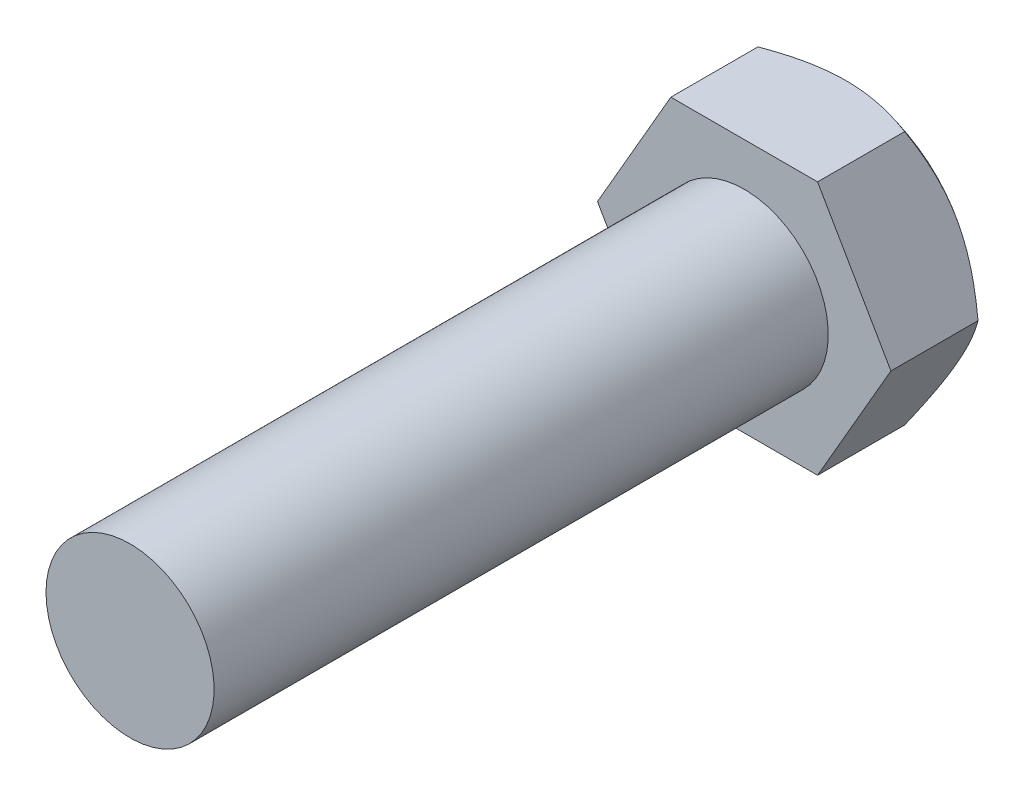
ISO-10303-21;
HEADER;
FILE_DESCRIPTION(('STEP AP214'),'2;1');
FILE_NAME('part.step','',(''),(''),'','','');
FILE_SCHEMA(('AUTOMOTIVE_DESIGN { 1 0 10303 214 1 1 1 1 }'));
ENDSEC;
DATA;
#1=APPLICATION_CONTEXT('core data for automotive mechanical design processes');
#2=APPLICATION_PROTOCOL_DEFINITION('international standard','automotive_design',2000,#1);
#3=PRODUCT_CONTEXT('',#1,'mechanical');
#4=PRODUCT('Part','Part','',(#3));
#5=PRODUCT_RELATED_PRODUCT_CATEGORY('part','',(#4));
#6=PRODUCT_DEFINITION_FORMATION('','',#4);
#7=PRODUCT_DEFINITION_CONTEXT('part definition',#1,'design');
#8=PRODUCT_DEFINITION('design','',#6,#7);
#9=PRODUCT_DEFINITION_SHAPE('','',#8);
#10=(LENGTH_UNIT() NAMED_UNIT(*) SI_UNIT(.MILLI.,.METRE.));
#11=(NAMED_UNIT(*) PLANE_ANGLE_UNIT() SI_UNIT($,.RADIAN.));
#12=(NAMED_UNIT(*) SI_UNIT($,.STERADIAN.) SOLID_ANGLE_UNIT());
#13=UNCERTAINTY_MEASURE_WITH_UNIT(LENGTH_MEASURE(1.E-05),#10,'distance_accuracy_value','');
#14=(GEOMETRIC_REPRESENTATION_CONTEXT(3) GLOBAL_UNCERTAINTY_ASSIGNED_CONTEXT((#13)) GLOBAL_UNIT_ASSIGNED_CONTEXT((#10,
#11,#12)) REPRESENTATION_CONTEXT('',''));
#15=CARTESIAN_POINT('',(0.,0.,0.));
#16=DIRECTION('',(0.,0.,1.));
#17=DIRECTION('',(1.,0.,0.));
#18=AXIS2_PLACEMENT_3D('',#15,#16,#17);
#19=CARTESIAN_POINT('',(6.92820323027565,-11.9999999999999,10.));
#20=DIRECTION('',(-0.866025403784442,0.499999999999995,0.));
#21=DIRECTION('',(-0.499999999999995,-0.866025403784442,0.));
#22=AXIS2_PLACEMENT_3D('',#19,#20,#21);
#23=PLANE('',#22);
#24=CARTESIAN_POINT('',(13.8565219306049,0.0002,1.775766646051));
#25=CARTESIAN_POINT('',(13.7292388440038,-0.220260772937203,1.67986463294664));
#26=CARTESIAN_POINT('',(13.6013138945537,-0.441833284940467,1.58741503736534));
#27=CARTESIAN_POINT('',(13.3440720142244,-0.887389291505411,1.41033708089712));
#28=CARTESIAN_POINT('',(13.2147546282987,-1.11137357423078,1.32571136914623));
#29=CARTESIAN_POINT('',(12.8239530093032,-1.78826183401108,1.08459062136647));
#30=CARTESIAN_POINT('',(12.5603312551438,-2.24486810619563,0.941399708417802));
#31=CARTESIAN_POINT('',(12.1624449977971,-2.9340273195535,0.760194543101507));
#32=CARTESIAN_POINT('',(12.0300388143479,-3.16336155652381,0.705569976057316));
#33=CARTESIAN_POINT('',(11.7641537636086,-3.62388797337733,0.60809260278285));
#34=CARTESIAN_POINT('',(11.6306750558265,-3.85507987698453,0.565238078259107));
#35=CARTESIAN_POINT('',(11.3630012145361,-4.31870456995673,0.492206557924749));
#36=CARTESIAN_POINT('',(11.2288070448848,-4.55113568987227,0.462015491135807));
#37=CARTESIAN_POINT('',(10.9598343897271,-5.01700999445203,0.414908187562502));
#38=CARTESIAN_POINT('',(10.8250559097075,-5.25045316961296,0.397991826397682));
#39=CARTESIAN_POINT('',(10.5533494842176,-5.72106250330436,0.377689977810674));
#40=CARTESIAN_POINT('',(10.4164178983548,-5.95823496717969,0.374497544111635));
#41=CARTESIAN_POINT('',(10.14265476926,-6.43240661601105,0.382250473563389));
#42=CARTESIAN_POINT('',(10.0058232267512,-6.66940579971434,0.393195937932634));
#43=CARTESIAN_POINT('',(9.73254334839989,-7.14274043370497,0.428966213113876));
#44=CARTESIAN_POINT('',(9.59609525932175,-7.379075456584,0.453798513821491));
#45=CARTESIAN_POINT('',(9.32397398321079,-7.85040333262867,0.516765146274355));
#46=CARTESIAN_POINT('',(9.18830079862324,-8.08539618155899,0.554899519971657));
#47=CARTESIAN_POINT('',(8.91803239074466,-8.55351479568543,0.643627734337574));
#48=CARTESIAN_POINT('',(8.78343679127604,-8.78664121244028,0.694217012055145));
#49=CARTESIAN_POINT('',(8.51544653197256,-9.25081395748747,0.80687907687528));
#50=CARTESIAN_POINT('',(8.38205204936019,-9.48185997882146,0.868953530394248));
#51=CARTESIAN_POINT('',(7.98396825884952,-10.1713613296556,1.07075168946474));
#52=CARTESIAN_POINT('',(7.72122770295004,-10.6264413216824,1.22610196182701));
#53=CARTESIAN_POINT('',(7.37172365966902,-11.2318000820958,1.45729868690344));
#54=CARTESIAN_POINT('',(7.2824408144576,-11.3864425062463,1.51855377450578));
#55=CARTESIAN_POINT('',(7.10470085944524,-11.6942971388627,1.64457775742975));
#56=CARTESIAN_POINT('',(7.01624244062025,-11.8475116146248,1.7093392615527));
#57=CARTESIAN_POINT('',(6.92808776022182,-12.0001999999999,1.775766646051));
#58=B_SPLINE_CURVE_WITH_KNOTS('',3,(#24,#25,#26,#27,#28,#29,#30,#31,#32,#33,#34,#35,#36,#37,#38,
#39,#40,#41,#42,#43,#44,#45,#46,#47,#48,#49,#50,#51,#52,#53,#54,#55,#56,#57),.UNSPECIFIED.,.F.,
.F.,(4,2,2,2,2,2,2,2,2,2,2,2,2,2,2,2,4),(0.,0.816022213091241,1.63231972382952,3.26948386945496,
4.08043544740799,4.89126857257092,5.7011983398215,6.51112051815518,7.33239929666443,
8.15368395504544,8.97541200292246,9.79714264238736,10.6185726812501,11.4401219972993,
13.0823046310725,13.6486296850621,14.2138042348016),.UNSPECIFIED.);
#59=CARTESIAN_POINT('',(13.856406460551,0.,1.77567963203661));
#60=VERTEX_POINT('',#59);
#61=CARTESIAN_POINT('',(6.92820323027565,-11.9999999999999,1.77567963203661));
#62=VERTEX_POINT('',#61);
#63=EDGE_CURVE('E50',#60,#62,#58,.T.);
#64=ORIENTED_EDGE('',*,*,#63,.F.);
#65=DIRECTION('',(0.,0.,-1.));
#66=VECTOR('',#65,1.);
#67=CARTESIAN_POINT('',(13.856406460551,0.,10.));
#68=LINE('',#67,#66);
#69=CARTESIAN_POINT('',(13.856406460551,0.,10.));
#70=VERTEX_POINT('',#69);
#71=EDGE_CURVE('E11',#70,#60,#68,.T.);
#72=ORIENTED_EDGE('',*,*,#71,.F.);
#73=DIRECTION('',(0.499999999999995,0.866025403784442,0.));
#74=VECTOR('',#73,1.);
#75=CARTESIAN_POINT('',(6.92820323027565,-11.9999999999999,10.));
#76=LINE('',#75,#74);
#77=CARTESIAN_POINT('',(6.92820323027565,-11.9999999999999,10.));
#78=VERTEX_POINT('',#77);
#79=EDGE_CURVE('E188',#78,#70,#76,.T.);
#80=ORIENTED_EDGE('',*,*,#79,.F.);
#81=DIRECTION('',(0.,0.,-1.));
#82=VECTOR('',#81,1.);
#83=CARTESIAN_POINT('',(6.92820323027565,-11.9999999999999,10.));
#84=LINE('',#83,#82);
#85=EDGE_CURVE('E107',#78,#62,#84,.T.);
#86=ORIENTED_EDGE('',*,*,#85,.T.);
#87=EDGE_LOOP('',(#64,#72,#80,#86));
#88=FACE_BOUND('',#87,.T.);
#89=ADVANCED_FACE('F35',(#88),#23,.F.);
#90=CARTESIAN_POINT('',(13.856406460551,0.,10.));
#91=DIRECTION('',(-0.866025403784438,-0.500000000000001,0.));
#92=DIRECTION('',(0.500000000000001,-0.866025403784438,0.));
#93=AXIS2_PLACEMENT_3D('',#90,#91,#92);
#94=PLANE('',#93);
#95=CARTESIAN_POINT('',(6.92808776022165,12.0002,1.775766646051));
#96=CARTESIAN_POINT('',(7.0553708468227,11.7797392270628,1.67986463294664));
#97=CARTESIAN_POINT('',(7.1832957962728,11.5581667150596,1.58741503736534));
#98=CARTESIAN_POINT('',(7.44053767660213,11.1126107084946,1.41033708089712));
#99=CARTESIAN_POINT('',(7.56985506252787,10.8886264257692,1.32571136914623));
#100=CARTESIAN_POINT('',(7.96065668152332,10.2117381659889,1.08459062136646));
#101=CARTESIAN_POINT('',(8.22427843568274,9.7551318938044,0.94139970841779));
#102=CARTESIAN_POINT('',(8.62216469302941,9.06597268044654,0.760194543101491));
#103=CARTESIAN_POINT('',(8.75457087647862,8.83663844347622,0.705569976057298));
#104=CARTESIAN_POINT('',(9.02045592721793,8.3761120266227,0.608092602782828));
#105=CARTESIAN_POINT('',(9.15393463500001,8.1449201230155,0.565238078259083));
#106=CARTESIAN_POINT('',(9.42160847629047,7.68129543004331,0.492206557924722));
#107=CARTESIAN_POINT('',(9.55580264594175,7.44886431012777,0.462015491135778));
#108=CARTESIAN_POINT('',(9.82477530109941,6.98299000554801,0.414908187562472));
#109=CARTESIAN_POINT('',(9.95955378111905,6.74954683038708,0.397991826397651));
#110=CARTESIAN_POINT('',(10.2312602066089,6.27893749669569,0.37768997781064));
#111=CARTESIAN_POINT('',(10.3681917924717,6.04176503282036,0.3744975441116));
#112=CARTESIAN_POINT('',(10.6419549215666,5.567593383989,0.38225047356335));
#113=CARTESIAN_POINT('',(10.7787864640754,5.33059420028571,0.393195937932593));
#114=CARTESIAN_POINT('',(11.0520663424267,4.85725956629508,0.428966213113833));
#115=CARTESIAN_POINT('',(11.1885144315048,4.62092454341605,0.453798513821447));
#116=CARTESIAN_POINT('',(11.4606357076158,4.14959666737138,0.516765146274309));
#117=CARTESIAN_POINT('',(11.5963088922033,3.91460381844106,0.554899519971611));
#118=CARTESIAN_POINT('',(11.8665773000819,3.44648520431461,0.643627734337526));
#119=CARTESIAN_POINT('',(12.0011728995505,3.21335878755977,0.694217012055095));
#120=CARTESIAN_POINT('',(12.269163158854,2.74918604251258,0.806879076875229));
#121=CARTESIAN_POINT('',(12.4025576414664,2.51814002117858,0.868953530394196));
#122=CARTESIAN_POINT('',(12.8006414319771,1.8286386703445,1.07075168946469));
#123=CARTESIAN_POINT('',(13.0633819878766,1.37355867831769,1.22610196182695));
#124=CARTESIAN_POINT('',(13.4128860311576,0.76819991790419,1.4572986869034));
#125=CARTESIAN_POINT('',(13.502168876369,0.613557493753676,1.51855377450575));
#126=CARTESIAN_POINT('',(13.6799088313814,0.305702861137222,1.64457775742973));
#127=CARTESIAN_POINT('',(13.7683672502064,0.152488385375103,1.70933926155269));
#128=CARTESIAN_POINT('',(13.8565219306049,-0.000200000000001125,1.775766646051));
#129=B_SPLINE_CURVE_WITH_KNOTS('',3,(#95,#96,#97,#98,#99,#100,#101,#102,#103,#104,#105,#106,
#107,#108,#109,#110,#111,#112,#113,#114,#115,#116,#117,#118,#119,#120,#121,#122,#123,#124,#125,
#126,#127,#128),.UNSPECIFIED.,.F.,.F.,(4,2,2,2,2,2,2,2,2,2,2,2,2,2,2,2,4),(0.,0.816022213091243,
1.63231972382952,3.26948386945497,4.080435447408,4.89126857257093,5.7011983398215,
6.51112051815519,7.33239929666444,8.15368395504546,8.97541200292247,9.79714264238737,
10.6185726812501,11.4401219972993,13.0823046310725,13.6486296850622,14.2138042348018),.UNSPECIFIED.);
#130=CARTESIAN_POINT('',(6.92820323027549,12.,1.77567963203661));
#131=VERTEX_POINT('',#130);
#132=EDGE_CURVE('E128',#131,#60,#129,.T.);
#133=ORIENTED_EDGE('',*,*,#132,.F.);
#134=DIRECTION('',(0.,0.,-1.));
#135=VECTOR('',#134,1.);
#136=CARTESIAN_POINT('',(6.92820323027549,12.,10.));
#137=LINE('',#136,#135);
#138=CARTESIAN_POINT('',(6.92820323027549,12.,10.));
#139=VERTEX_POINT('',#138);
#140=EDGE_CURVE('E43',#139,#131,#137,.T.);
#141=ORIENTED_EDGE('',*,*,#140,.F.);
#142=DIRECTION('',(-0.500000000000001,0.866025403784438,0.));
#143=VECTOR('',#142,1.);
#144=CARTESIAN_POINT('',(13.856406460551,0.,10.));
#145=LINE('',#144,#143);
#146=EDGE_CURVE('E127',#70,#139,#145,.T.);
#147=ORIENTED_EDGE('',*,*,#146,.F.);
#148=ORIENTED_EDGE('',*,*,#71,.T.);
#149=EDGE_LOOP('',(#133,#141,#147,#148));
#150=FACE_BOUND('',#149,.T.);
#151=ADVANCED_FACE('F126',(#150),#94,.F.);
#152=CARTESIAN_POINT('',(6.92820323027549,12.,10.));
#153=DIRECTION('',(0.,-1.,0.));
#154=DIRECTION('',(1.,0.,0.));
#155=AXIS2_PLACEMENT_3D('',#152,#153,#154);
#156=PLANE('',#155);
#157=CARTESIAN_POINT('',(-16.6545790115757,11.9999999999999,6.80264945722864));
#158=CARTESIAN_POINT('',(-16.4354462658992,11.9999999999999,6.66867779525732));
#159=CARTESIAN_POINT('',(-16.2159139376454,11.9999999999999,6.53536009587071));
#160=CARTESIAN_POINT('',(-15.7759747522613,11.9999999999999,6.27016913055208));
#161=CARTESIAN_POINT('',(-15.5555678833952,11.9999999999999,6.13829588409364));
#162=CARTESIAN_POINT('',(-14.8928489375304,11.9999999999999,5.74500411167324));
#163=CARTESIAN_POINT('',(-14.4491201637668,12.,5.4859636029043));
#164=CARTESIAN_POINT('',(-13.5542821556388,12.,4.97394012389985));
#165=CARTESIAN_POINT('',(-13.1031435463723,12.,4.72100837179899));
#166=CARTESIAN_POINT('',(-12.1955775203499,12.,4.22484932555583));
#167=CARTESIAN_POINT('',(-11.7391504099162,12.,3.98162147293168));
#168=CARTESIAN_POINT('',(-10.7978870087619,12.,3.49582507690646));
#169=CARTESIAN_POINT('',(-10.3127413665509,12.,3.25385274110973));
#170=CARTESIAN_POINT('',(-9.33425867766728,12.,2.78678660697865));
#171=CARTESIAN_POINT('',(-8.84092052087729,12.,2.56169511923897));
#172=CARTESIAN_POINT('',(-7.84604439929145,12.,2.13374445748784));
#173=CARTESIAN_POINT('',(-7.34452968707175,12.,1.930831764281));
#174=CARTESIAN_POINT('',(-6.33124725399912,12.,1.55280422367483));
#175=CARTESIAN_POINT('',(-5.81948352092351,12.,1.37767879244917));
#176=CARTESIAN_POINT('',(-4.77515410056802,12.,1.05965292906328));
#177=CARTESIAN_POINT('',(-4.24237801167951,12.,0.917425504530361));
#178=CARTESIAN_POINT('',(-3.43569243055862,12.,0.738104829770756));
#179=CARTESIAN_POINT('',(-3.16552039431333,12.,0.683998198053821));
#180=CARTESIAN_POINT('',(-2.62300614971486,12.,0.588149006788632));
#181=CARTESIAN_POINT('',(-2.35066425742182,12.,0.54640467918132));
#182=CARTESIAN_POINT('',(-1.80902692094948,12.,0.476780102672166));
#183=CARTESIAN_POINT('',(-1.53976099720723,12.,0.448671113798085));
#184=CARTESIAN_POINT('',(-1.00015791410955,12.,0.405878414023496));
#185=CARTESIAN_POINT('',(-0.729820763029907,12.,0.391194599608964));
#186=CARTESIAN_POINT('',(-0.188750919349772,12.,0.375601045913184));
#187=CARTESIAN_POINT('',(0.0819817676585303,12.,0.374691113742371));
#188=CARTESIAN_POINT('',(0.623136982831926,12.,0.386666698252816));
#189=CARTESIAN_POINT('',(0.893559514969135,12.,0.399552036239435));
#190=CARTESIAN_POINT('',(1.41037046801603,12.,0.4371346987278));
#191=CARTESIAN_POINT('',(1.65683985034852,12.,0.460729736983616));
#192=CARTESIAN_POINT('',(2.14850958514257,12.,0.518746085720883));
#193=CARTESIAN_POINT('',(2.39370978396814,12.,0.553168677112847));
#194=CARTESIAN_POINT('',(3.12678384595219,12.,0.671794814280073));
#195=CARTESIAN_POINT('',(3.61224789643006,12.,0.771365702114504));
#196=CARTESIAN_POINT('',(4.33859257708326,12.,0.948050650792354));
#197=CARTESIAN_POINT('',(4.58276257465087,12.,1.01226269482453));
#198=CARTESIAN_POINT('',(5.06880579657827,12.,1.14892082461193));
#199=CARTESIAN_POINT('',(5.31067900328181,12.,1.22136697361022));
#200=CARTESIAN_POINT('',(5.79202410077936,12.,1.37365774557733));
#201=CARTESIAN_POINT('',(6.03149640455281,12.,1.45350107109295));
#202=CARTESIAN_POINT('',(6.50810849055909,12.,1.6198208212294));
#203=CARTESIAN_POINT('',(6.74524835078817,12.,1.70629702319209));
#204=CARTESIAN_POINT('',(7.44267244689806,12.,1.97056775539961));
#205=CARTESIAN_POINT('',(7.8998033872006,12.,2.15670967855681));
#206=CARTESIAN_POINT('',(8.806358944345,12.,2.54699139893122));
#207=CARTESIAN_POINT('',(9.25578163270081,12.,2.75113562379952));
#208=CARTESIAN_POINT('',(10.1482177975964,12.,3.17394297776244));
#209=CARTESIAN_POINT('',(10.5912250282095,12.,3.39261923096903));
#210=CARTESIAN_POINT('',(11.4713140712485,12.,3.84144916075925));
#211=CARTESIAN_POINT('',(11.9083963510877,12.,4.0716019251914));
#212=CARTESIAN_POINT('',(12.7795201236306,12.,4.54226848174263));
#213=CARTESIAN_POINT('',(13.2135384960504,12.,4.78282492894843));
#214=CARTESIAN_POINT('',(14.0772521904633,12.,5.27157314039696));
#215=CARTESIAN_POINT('',(14.5069474431203,12.,5.51976502684213));
#216=CARTESIAN_POINT('',(15.3624379679647,12.0000000000001,6.02230136915753));
#217=CARTESIAN_POINT('',(15.7882350276021,12.0000000000001,6.27664278809294));
#218=CARTESIAN_POINT('',(16.636665740134,12.0000000000001,6.79053166652485));
#219=CARTESIAN_POINT('',(17.0592994157908,12.0000000000001,7.05007908851181));
#220=CARTESIAN_POINT('',(18.2369727710377,12.0000000000001,7.78170006515628));
#221=CARTESIAN_POINT('',(18.9890114045044,12.0000000000001,8.25860374648349));
#222=CARTESIAN_POINT('',(20.4864863415798,12.0000000000001,9.2228301495116));
#223=CARTESIAN_POINT('',(21.2319217929267,12.0000000000001,9.71015418921908));
#224=CARTESIAN_POINT('',(22.7102772035603,12.0000000000001,10.6878912874887));
#225=CARTESIAN_POINT('',(23.4432482186419,12.0000000000001,11.1782272444957));
#226=CARTESIAN_POINT('',(24.5395671154383,12.0000000000001,11.9182141374448));
#227=CARTESIAN_POINT('',(24.9044483364517,12.0000000000001,12.1655992214002));
#228=CARTESIAN_POINT('',(25.6332888197833,12.0000000000001,12.661719586274));
#229=CARTESIAN_POINT('',(25.9972480873156,12.0000000000001,12.9104548595312));
#230=CARTESIAN_POINT('',(26.3607983132064,12.0000000000001,13.1597868386109));
#231=B_SPLINE_CURVE_WITH_KNOTS('',3,(#157,#158,#159,#160,#161,#162,#163,#164,#165,#166,#167,
#168,#169,#170,#171,#172,#173,#174,#175,#176,#177,#178,#179,#180,#181,#182,#183,#184,#185,#186,
#187,#188,#189,#190,#191,#192,#193,#194,#195,#196,#197,#198,#199,#200,#201,#202,#203,#204,#205,
#206,#207,#208,#209,#210,#211,#212,#213,#214,#215,#216,#217,#218,#219,#220,#221,#222,#223,#224,
#225,#226,#227,#228,#229,#230),.UNSPECIFIED.,.F.,.F.,(4,2,2,2,2,2,2,2,2,2,2,2,2,2,2,2,2,2,2,2,2,
2,2,2,2,2,2,2,2,2,2,2,2,2,2,2,4),(0.,0.770522451198352,1.54105527753677,3.08240819459341,
4.63392665197378,6.18535568668932,7.81152190038205,9.4379102936159,11.0602831522539,
12.6820365779219,14.3344995244582,15.1608713934055,15.9871250173515,16.7989922737222,
17.6108532701851,18.422702897329,19.2345420084468,19.9770751018939,20.7196960708173,
22.2045879433868,22.961904702428,23.719227278529,24.476417272011,25.2335818585983,
26.7137684133183,28.1943200394874,29.6762274410737,31.1580172480222,32.6465989237229,
34.1352044360415,35.6230892418986,37.1109633313074,39.7823488031869,42.4540741844769,
45.0996110417009,46.4221212376836,47.7446239373677),.UNSPECIFIED.);
#232=CARTESIAN_POINT('',(-6.92820323027557,12.,1.77567963203661));
#233=VERTEX_POINT('',#232);
#234=EDGE_CURVE('E122',#233,#131,#231,.T.);
#235=ORIENTED_EDGE('',*,*,#234,.F.);
#236=DIRECTION('',(0.,0.,-1.));
#237=VECTOR('',#236,1.);
#238=CARTESIAN_POINT('',(-6.92820323027557,12.,10.));
#239=LINE('',#238,#237);
#240=CARTESIAN_POINT('',(-6.92820323027557,12.,10.));
#241=VERTEX_POINT('',#240);
#242=EDGE_CURVE('E109',#241,#233,#239,.T.);
#243=ORIENTED_EDGE('',*,*,#242,.F.);
#244=DIRECTION('',(-1.,0.,0.));
#245=VECTOR('',#244,1.);
#246=CARTESIAN_POINT('',(6.92820323027549,12.,10.));
#247=LINE('',#246,#245);
#248=EDGE_CURVE('E123',#139,#241,#247,.T.);
#249=ORIENTED_EDGE('',*,*,#248,.F.);
#250=ORIENTED_EDGE('',*,*,#140,.T.);
#251=EDGE_LOOP('',(#235,#243,#249,#250));
#252=FACE_BOUND('',#251,.T.);
#253=ADVANCED_FACE('F120',(#252),#156,.F.);
#254=CARTESIAN_POINT('',(-6.92820323027557,12.,10.));
#255=DIRECTION('',(0.866025403784442,-0.499999999999995,0.));
#256=DIRECTION('',(0.499999999999995,0.866025403784442,0.));
#257=AXIS2_PLACEMENT_3D('',#254,#255,#256);
#258=PLANE('',#257);
#259=CARTESIAN_POINT('',(-13.8565219306049,-0.000200000000096681,1.775766646051));
#260=CARTESIAN_POINT('',(-13.7292388440038,0.220260772937106,1.67986463294664));
#261=CARTESIAN_POINT('',(-13.6013138945537,0.44183328494037,1.58741503736534));
#262=CARTESIAN_POINT('',(-13.3440720142244,0.887389291505315,1.41033708089711));
#263=CARTESIAN_POINT('',(-13.2147546282987,1.11137357423069,1.32571136914623));
#264=CARTESIAN_POINT('',(-12.8239530093032,1.78826183401099,1.08459062136646));
#265=CARTESIAN_POINT('',(-12.5603312551438,2.24486810619554,0.941399708417789));
#266=CARTESIAN_POINT('',(-12.1624449977971,2.9340273195534,0.76019454310149));
#267=CARTESIAN_POINT('',(-12.0300388143479,3.16336155652372,0.705569976057297));
#268=CARTESIAN_POINT('',(-11.7641537636086,3.62388797337724,0.608092602782827));
#269=CARTESIAN_POINT('',(-11.6306750558265,3.85507987698444,0.565238078259082));
#270=CARTESIAN_POINT('',(-11.3630012145361,4.31870456995664,0.492206557924721));
#271=CARTESIAN_POINT('',(-11.2288070448848,4.55113568987217,0.462015491135779));
#272=CARTESIAN_POINT('',(-10.9598343897271,5.01700999445193,0.414908187562472));
#273=CARTESIAN_POINT('',(-10.8250559097075,5.25045316961287,0.397991826397651));
#274=CARTESIAN_POINT('',(-10.5533494842176,5.72106250330426,0.377689977810639));
#275=CARTESIAN_POINT('',(-10.4164178983548,5.95823496717959,0.374497544111597));
#276=CARTESIAN_POINT('',(-10.14265476926,6.43240661601095,0.382250473563349));
#277=CARTESIAN_POINT('',(-10.0058232267512,6.66940579971425,0.393195937932594));
#278=CARTESIAN_POINT('',(-9.73254334839989,7.14274043370488,0.428966213113834));
#279=CARTESIAN_POINT('',(-9.59609525932175,7.37907545658391,0.453798513821448));
#280=CARTESIAN_POINT('',(-9.32397398321079,7.85040333262858,0.516765146274308));
#281=CARTESIAN_POINT('',(-9.18830079862323,8.0853961815589,0.554899519971609));
#282=CARTESIAN_POINT('',(-8.91803239074466,8.55351479568534,0.643627734337524));
#283=CARTESIAN_POINT('',(-8.78343679127604,8.78664121244019,0.694217012055094));
#284=CARTESIAN_POINT('',(-8.51544653197256,9.25081395748738,0.806879076875228));
#285=CARTESIAN_POINT('',(-8.38205204936018,9.48185997882138,0.868953530394195));
#286=CARTESIAN_POINT('',(-7.98396825884952,10.1713613296555,1.07075168946469));
#287=CARTESIAN_POINT('',(-7.72122770295003,10.6264413216823,1.22610196182695));
#288=CARTESIAN_POINT('',(-7.371723659669,11.2318000820958,1.4572986869034));
#289=CARTESIAN_POINT('',(-7.28244081445756,11.3864425062463,1.51855377450575));
#290=CARTESIAN_POINT('',(-7.10470085944518,11.6942971388628,1.64457775742973));
#291=CARTESIAN_POINT('',(-7.01624244062018,11.8475116146249,1.70933926155269));
#292=CARTESIAN_POINT('',(-6.92808776022173,12.0002,1.775766646051));
#293=B_SPLINE_CURVE_WITH_KNOTS('',3,(#259,#260,#261,#262,#263,#264,#265,#266,#267,#268,#269,
#270,#271,#272,#273,#274,#275,#276,#277,#278,#279,#280,#281,#282,#283,#284,#285,#286,#287,#288,
#289,#290,#291,#292),.UNSPECIFIED.,.F.,.F.,(4,2,2,2,2,2,2,2,2,2,2,2,2,2,2,2,4),(0.,
0.816022213091243,1.63231972382952,3.26948386945497,4.080435447408,4.89126857257093,
5.7011983398215,6.51112051815519,7.33239929666444,8.15368395504545,8.97541200292247,
9.79714264238737,10.6185726812501,11.4401219972993,13.0823046310725,13.6486296850622,
14.2138042348018),.UNSPECIFIED.);
#294=CARTESIAN_POINT('',(-13.856406460551,0.,1.77567963203661));
#295=VERTEX_POINT('',#294);
#296=EDGE_CURVE('E104',#295,#233,#293,.T.);
#297=ORIENTED_EDGE('',*,*,#296,.F.);
#298=DIRECTION('',(0.,0.,-1.));
#299=VECTOR('',#298,1.);
#300=CARTESIAN_POINT('',(-13.856406460551,0.,10.));
#301=LINE('',#300,#299);
#302=CARTESIAN_POINT('',(-13.856406460551,0.,10.));
#303=VERTEX_POINT('',#302);
#304=EDGE_CURVE('E103',#303,#295,#301,.T.);
#305=ORIENTED_EDGE('',*,*,#304,.F.);
#306=DIRECTION('',(-0.499999999999995,-0.866025403784441,0.));
#307=VECTOR('',#306,1.);
#308=CARTESIAN_POINT('',(-6.92820323027557,12.,10.));
#309=LINE('',#308,#307);
#310=EDGE_CURVE('E196',#241,#303,#309,.T.);
#311=ORIENTED_EDGE('',*,*,#310,.F.);
#312=ORIENTED_EDGE('',*,*,#242,.T.);
#313=EDGE_LOOP('',(#297,#305,#311,#312));
#314=FACE_BOUND('',#313,.T.);
#315=ADVANCED_FACE('F173',(#314),#258,.F.);
#316=CARTESIAN_POINT('',(-13.856406460551,0.,10.));
#317=DIRECTION('',(0.866025403784434,0.500000000000007,0.));
#318=DIRECTION('',(-0.500000000000007,0.866025403784435,0.));
#319=AXIS2_PLACEMENT_3D('',#316,#317,#318);
#320=PLANE('',#319);
#321=CARTESIAN_POINT('',(-6.92808776022156,-12.0002000000001,1.775766646051));
#322=CARTESIAN_POINT('',(-7.05537084682261,-11.7797392270629,1.67986463294664));
#323=CARTESIAN_POINT('',(-7.18329579627272,-11.5581667150596,1.58741503736534));
#324=CARTESIAN_POINT('',(-7.44053767660205,-11.1126107084947,1.41033708089711));
#325=CARTESIAN_POINT('',(-7.56985506252779,-10.8886264257693,1.32571136914623));
#326=CARTESIAN_POINT('',(-7.96065668152324,-10.211738165989,1.08459062136646));
#327=CARTESIAN_POINT('',(-8.22427843568267,-9.75513189380446,0.941399708417789));
#328=CARTESIAN_POINT('',(-8.62216469302935,-9.0659726804466,0.760194543101489));
#329=CARTESIAN_POINT('',(-8.75457087647856,-8.83663844347628,0.705569976057296));
#330=CARTESIAN_POINT('',(-9.02045592721787,-8.37611202662277,0.608092602782827));
#331=CARTESIAN_POINT('',(-9.15393463499996,-8.14492012301557,0.565238078259083));
#332=CARTESIAN_POINT('',(-9.42160847629042,-7.68129543004337,0.492206557924723));
#333=CARTESIAN_POINT('',(-9.5558026459417,-7.44886431012784,0.462015491135779));
#334=CARTESIAN_POINT('',(-9.82477530109936,-6.98299000554808,0.414908187562471));
#335=CARTESIAN_POINT('',(-9.959553781119,-6.74954683038715,0.39799182639765));
#336=CARTESIAN_POINT('',(-10.2312602066089,-6.27893749669576,0.377689977810639));
#337=CARTESIAN_POINT('',(-10.3681917924717,-6.04176503282043,0.374497544111599));
#338=CARTESIAN_POINT('',(-10.6419549215666,-5.56759338398908,0.38225047356335));
#339=CARTESIAN_POINT('',(-10.7787864640754,-5.33059420028578,0.393195937932593));
#340=CARTESIAN_POINT('',(-11.0520663424266,-4.85725956629516,0.428966213113833));
#341=CARTESIAN_POINT('',(-11.1885144315048,-4.62092454341613,0.453798513821447));
#342=CARTESIAN_POINT('',(-11.4606357076158,-4.14959666737146,0.516765146274308));
#343=CARTESIAN_POINT('',(-11.5963088922033,-3.91460381844114,0.554899519971609));
#344=CARTESIAN_POINT('',(-11.8665773000819,-3.4464852043147,0.643627734337525));
#345=CARTESIAN_POINT('',(-12.0011728995505,-3.21335878755986,0.694217012055095));
#346=CARTESIAN_POINT('',(-12.269163158854,-2.74918604251267,0.806879076875228));
#347=CARTESIAN_POINT('',(-12.4025576414664,-2.51814002117867,0.868953530394196));
#348=CARTESIAN_POINT('',(-12.8006414319771,-1.82863867034459,1.07075168946469));
#349=CARTESIAN_POINT('',(-13.0633819878765,-1.37355867831779,1.22610196182695));
#350=CARTESIAN_POINT('',(-13.4128860311576,-0.768199917904283,1.4572986869034));
#351=CARTESIAN_POINT('',(-13.502168876369,-0.61355749375377,1.51855377450575));
#352=CARTESIAN_POINT('',(-13.6799088313814,-0.305702861137318,1.64457775742973));
#353=CARTESIAN_POINT('',(-13.7683672502064,-0.152488385375199,1.70933926155269));
#354=CARTESIAN_POINT('',(-13.8565219306049,0.000199999999904161,1.775766646051));
#355=B_SPLINE_CURVE_WITH_KNOTS('',3,(#321,#322,#323,#324,#325,#326,#327,#328,#329,#330,#331,
#332,#333,#334,#335,#336,#337,#338,#339,#340,#341,#342,#343,#344,#345,#346,#347,#348,#349,#350,
#351,#352,#353,#354),.UNSPECIFIED.,.F.,.F.,(4,2,2,2,2,2,2,2,2,2,2,2,2,2,2,2,4),(0.,
0.816022213091244,1.63231972382952,3.26948386945497,4.080435447408,4.89126857257093,
5.70119833982151,6.51112051815519,7.33239929666444,8.15368395504545,8.97541200292247,
9.79714264238737,10.6185726812501,11.4401219972993,13.0823046310725,13.6486296850622,
14.2138042348018),.UNSPECIFIED.);
#356=CARTESIAN_POINT('',(-6.9282032302754,-12.0000000000001,1.77567963203661));
#357=VERTEX_POINT('',#356);
#358=EDGE_CURVE('E89',#357,#295,#355,.T.);
#359=ORIENTED_EDGE('',*,*,#358,.F.);
#360=DIRECTION('',(0.,0.,-1.));
#361=VECTOR('',#360,1.);
#362=CARTESIAN_POINT('',(-6.9282032302754,-12.0000000000001,10.));
#363=LINE('',#362,#361);
#364=CARTESIAN_POINT('',(-6.9282032302754,-12.0000000000001,10.));
#365=VERTEX_POINT('',#364);
#366=EDGE_CURVE('E101',#365,#357,#363,.T.);
#367=ORIENTED_EDGE('',*,*,#366,.F.);
#368=DIRECTION('',(0.500000000000007,-0.866025403784435,0.));
#369=VECTOR('',#368,1.);
#370=CARTESIAN_POINT('',(-13.856406460551,0.,10.));
#371=LINE('',#370,#369);
#372=EDGE_CURVE('E198',#303,#365,#371,.T.);
#373=ORIENTED_EDGE('',*,*,#372,.F.);
#374=ORIENTED_EDGE('',*,*,#304,.T.);
#375=EDGE_LOOP('',(#359,#367,#373,#374));
#376=FACE_BOUND('',#375,.T.);
#377=ADVANCED_FACE('F99',(#376),#320,.F.);
#378=CARTESIAN_POINT('',(-6.9282032302754,-12.0000000000001,10.));
#379=DIRECTION('',(0.,1.,0.));
#380=DIRECTION('',(-1.,0.,0.));
#381=AXIS2_PLACEMENT_3D('',#378,#379,#380);
#382=PLANE('',#381);
#383=CARTESIAN_POINT('',(-16.6545790115756,-12.0000000000002,6.80264945722864));
#384=CARTESIAN_POINT('',(-16.4354462658991,-12.0000000000002,6.66867779525732));
#385=CARTESIAN_POINT('',(-16.2159139376452,-12.0000000000002,6.53536009587071));
#386=CARTESIAN_POINT('',(-15.7759747522611,-12.0000000000002,6.27016913055209));
#387=CARTESIAN_POINT('',(-15.5555678833951,-12.0000000000002,6.13829588409364));
#388=CARTESIAN_POINT('',(-14.8928489375302,-12.0000000000002,5.74500411167324));
#389=CARTESIAN_POINT('',(-14.4491201637666,-12.0000000000002,5.48596360290431));
#390=CARTESIAN_POINT('',(-13.5542821556387,-12.0000000000001,4.97394012389985));
#391=CARTESIAN_POINT('',(-13.1031435463721,-12.0000000000001,4.72100837179899));
#392=CARTESIAN_POINT('',(-12.1955775203497,-12.0000000000001,4.22484932555583));
#393=CARTESIAN_POINT('',(-11.739150409916,-12.0000000000001,3.98162147293169));
#394=CARTESIAN_POINT('',(-10.7978870087618,-12.0000000000001,3.49582507690646));
#395=CARTESIAN_POINT('',(-10.3127413665507,-12.0000000000001,3.25385274110973));
#396=CARTESIAN_POINT('',(-9.33425867766711,-12.0000000000001,2.78678660697865));
#397=CARTESIAN_POINT('',(-8.84092052087712,-12.0000000000001,2.56169511923897));
#398=CARTESIAN_POINT('',(-7.84604439929129,-12.0000000000001,2.13374445748784));
#399=CARTESIAN_POINT('',(-7.34452968707159,-12.0000000000001,1.930831764281));
#400=CARTESIAN_POINT('',(-6.33124725399896,-12.0000000000001,1.55280422367483));
#401=CARTESIAN_POINT('',(-5.81948352092334,-12.0000000000001,1.37767879244918));
#402=CARTESIAN_POINT('',(-4.77515410056786,-12.,1.05965292906328));
#403=CARTESIAN_POINT('',(-4.24237801167935,-12.,0.917425504530361));
#404=CARTESIAN_POINT('',(-3.43569243055845,-12.,0.738104829770756));
#405=CARTESIAN_POINT('',(-3.16552039431316,-12.,0.683998198053822));
#406=CARTESIAN_POINT('',(-2.6230061497147,-12.,0.588149006788634));
#407=CARTESIAN_POINT('',(-2.35066425742165,-12.,0.546404679181322));
#408=CARTESIAN_POINT('',(-1.80902692094932,-12.,0.476780102672166));
#409=CARTESIAN_POINT('',(-1.53976099720706,-12.,0.448671113798084));
#410=CARTESIAN_POINT('',(-1.00015791410939,-12.,0.405878414023495));
#411=CARTESIAN_POINT('',(-0.729820763029742,-12.,0.391194599608963));
#412=CARTESIAN_POINT('',(-0.188750919349609,-12.,0.375601045913184));
#413=CARTESIAN_POINT('',(0.0819817676586923,-12.,0.37469111374237));
#414=CARTESIAN_POINT('',(0.623136982832087,-12.,0.386666698252815));
#415=CARTESIAN_POINT('',(0.893559514969296,-12.,0.399552036239434));
#416=CARTESIAN_POINT('',(1.41037046801619,-12.,0.4371346987278));
#417=CARTESIAN_POINT('',(1.65683985034868,-12.,0.460729736983616));
#418=CARTESIAN_POINT('',(2.14850958514273,-12.,0.518746085720882));
#419=CARTESIAN_POINT('',(2.3937097839683,-12.,0.553168677112846));
#420=CARTESIAN_POINT('',(3.12678384595235,-12.,0.671794814280071));
#421=CARTESIAN_POINT('',(3.61224789643022,-12.,0.771365702114503));
#422=CARTESIAN_POINT('',(4.33859257708342,-12.,0.948050650792354));
#423=CARTESIAN_POINT('',(4.58276257465103,-12.,1.01226269482453));
#424=CARTESIAN_POINT('',(5.06880579657843,-11.9999999999999,1.14892082461193));
#425=CARTESIAN_POINT('',(5.31067900328197,-11.9999999999999,1.22136697361022));
#426=CARTESIAN_POINT('',(5.79202410077952,-11.9999999999999,1.37365774557732));
#427=CARTESIAN_POINT('',(6.03149640455297,-11.9999999999999,1.45350107109294));
#428=CARTESIAN_POINT('',(6.50810849055925,-11.9999999999999,1.6198208212294));
#429=CARTESIAN_POINT('',(6.74524835078834,-11.9999999999999,1.70629702319209));
#430=CARTESIAN_POINT('',(7.44267244689822,-11.9999999999999,1.9705677553996));
#431=CARTESIAN_POINT('',(7.89980338720077,-11.9999999999999,2.1567096785568));
#432=CARTESIAN_POINT('',(8.80635894434516,-11.9999999999999,2.54699139893122));
#433=CARTESIAN_POINT('',(9.25578163270097,-11.9999999999999,2.75113562379952));
#434=CARTESIAN_POINT('',(10.1482177975966,-11.9999999999999,3.17394297776244));
#435=CARTESIAN_POINT('',(10.5912250282097,-11.9999999999999,3.39261923096903));
#436=CARTESIAN_POINT('',(11.4713140712486,-11.9999999999999,3.84144916075925));
#437=CARTESIAN_POINT('',(11.9083963510878,-11.9999999999999,4.0716019251914));
#438=CARTESIAN_POINT('',(12.7795201236307,-11.9999999999999,4.54226848174262));
#439=CARTESIAN_POINT('',(13.2135384960505,-11.9999999999999,4.78282492894842));
#440=CARTESIAN_POINT('',(14.0772521904635,-11.9999999999999,5.27157314039694));
#441=CARTESIAN_POINT('',(14.5069474431205,-11.9999999999998,5.51976502684212));
#442=CARTESIAN_POINT('',(15.3624379679649,-11.9999999999998,6.02230136915752));
#443=CARTESIAN_POINT('',(15.7882350276023,-11.9999999999998,6.27664278809293));
#444=CARTESIAN_POINT('',(16.6366657401342,-11.9999999999998,6.79053166652484));
#445=CARTESIAN_POINT('',(17.059299415791,-11.9999999999998,7.05007908851179));
#446=CARTESIAN_POINT('',(18.2369727710379,-11.9999999999998,7.78170006515626));
#447=CARTESIAN_POINT('',(18.9890114045046,-11.9999999999998,8.25860374648347));
#448=CARTESIAN_POINT('',(20.48648634158,-11.9999999999998,9.22283014951159));
#449=CARTESIAN_POINT('',(21.2319217929268,-11.9999999999998,9.71015418921906));
#450=CARTESIAN_POINT('',(22.7102772035605,-11.9999999999998,10.6878912874887));
#451=CARTESIAN_POINT('',(23.4432482186421,-11.9999999999998,11.1782272444956));
#452=CARTESIAN_POINT('',(24.5395671154385,-11.9999999999997,11.9182141374447));
#453=CARTESIAN_POINT('',(24.9044483364519,-11.9999999999997,12.1655992214002));
#454=CARTESIAN_POINT('',(25.6332888197834,-11.9999999999997,12.661719586274));
#455=CARTESIAN_POINT('',(25.9972480873158,-11.9999999999997,12.9104548595312));
#456=CARTESIAN_POINT('',(26.3607983132066,-11.9999999999997,13.1597868386108));
#457=B_SPLINE_CURVE_WITH_KNOTS('',3,(#383,#384,#385,#386,#387,#388,#389,#390,#391,#392,#393,
#394,#395,#396,#397,#398,#399,#400,#401,#402,#403,#404,#405,#406,#407,#408,#409,#410,#411,#412,
#413,#414,#415,#416,#417,#418,#419,#420,#421,#422,#423,#424,#425,#426,#427,#428,#429,#430,#431,
#432,#433,#434,#435,#436,#437,#438,#439,#440,#441,#442,#443,#444,#445,#446,#447,#448,#449,#450,
#451,#452,#453,#454,#455,#456),.UNSPECIFIED.,.F.,.F.,(4,2,2,2,2,2,2,2,2,2,2,2,2,2,2,2,2,2,2,2,2,
2,2,2,2,2,2,2,2,2,2,2,2,2,2,2,4),(0.,0.770522451198356,1.54105527753677,3.08240819459341,
4.63392665197379,6.18535568668932,7.81152190038205,9.43791029361591,11.0602831522539,
12.6820365779219,14.3344995244582,15.1608713934055,15.9871250173515,16.7989922737222,
17.6108532701851,18.422702897329,19.2345420084468,19.9770751018939,20.7196960708173,
22.2045879433868,22.961904702428,23.719227278529,24.476417272011,25.2335818585984,
26.7137684133183,28.1943200394874,29.6762274410737,31.1580172480222,32.6465989237229,
34.1352044360415,35.6230892418986,37.1109633313074,39.7823488031869,42.4540741844769,
45.0996110417009,46.4221212376836,47.7446239373676),.UNSPECIFIED.);
#458=EDGE_CURVE('E86',#62,#357,#457,.F.);
#459=ORIENTED_EDGE('',*,*,#458,.F.);
#460=ORIENTED_EDGE('',*,*,#85,.F.);
#461=DIRECTION('',(1.,0.,0.));
#462=VECTOR('',#461,1.);
#463=CARTESIAN_POINT('',(-6.9282032302754,-12.0000000000001,10.));
#464=LINE('',#463,#462);
#465=EDGE_CURVE('E58',#365,#78,#464,.T.);
#466=ORIENTED_EDGE('',*,*,#465,.F.);
#467=ORIENTED_EDGE('',*,*,#366,.T.);
#468=EDGE_LOOP('',(#459,#460,#466,#467));
#469=FACE_BOUND('',#468,.T.);
#470=ADVANCED_FACE('F106',(#469),#382,.F.);
#471=CARTESIAN_POINT('',(0.,0.,10.));
#472=DIRECTION('',(0.,0.,1.));
#473=DIRECTION('',(1.,0.,0.));
#474=AXIS2_PLACEMENT_3D('',#471,#472,#473);
#475=PLANE('',#474);
#476=CARTESIAN_POINT('',(0.,0.,10.));
#477=DIRECTION('',(0.,0.,1.));
#478=DIRECTION('',(1.,0.,0.));
#479=AXIS2_PLACEMENT_3D('',#476,#477,#478);
#480=CIRCLE('',#479,7.9375);
#481=CARTESIAN_POINT('',(-7.9375,0.,10.));
#482=VERTEX_POINT('',#481);
#483=EDGE_CURVE('E131',#482,#482,#480,.T.);
#484=ORIENTED_EDGE('',*,*,#483,.F.);
#485=EDGE_LOOP('',(#484));
#486=FACE_BOUND('',#485,.T.);
#487=ORIENTED_EDGE('',*,*,#79,.T.);
#488=ORIENTED_EDGE('',*,*,#146,.T.);
#489=ORIENTED_EDGE('',*,*,#248,.T.);
#490=ORIENTED_EDGE('',*,*,#310,.T.);
#491=ORIENTED_EDGE('',*,*,#372,.T.);
#492=ORIENTED_EDGE('',*,*,#465,.T.);
#493=EDGE_LOOP('',(#487,#488,#489,#490,#491,#492));
#494=FACE_BOUND('',#493,.T.);
#495=ADVANCED_FACE('F199',(#486,#494),#475,.T.);
#496=CARTESIAN_POINT('',(0.,0.,68.));
#497=DIRECTION('',(0.,0.,-1.));
#498=DIRECTION('',(-1.,0.,0.));
#499=AXIS2_PLACEMENT_3D('',#496,#497,#498);
#500=CYLINDRICAL_SURFACE('',#499,7.9375);
#501=CARTESIAN_POINT('',(0.,0.,68.));
#502=DIRECTION('',(0.,0.,1.));
#503=DIRECTION('',(1.,0.,0.));
#504=AXIS2_PLACEMENT_3D('',#501,#502,#503);
#505=CIRCLE('',#504,7.9375);
#506=CARTESIAN_POINT('',(-7.9375,0.,68.));
#507=VERTEX_POINT('',#506);
#508=EDGE_CURVE('E189',#507,#507,#505,.T.);
#509=CARTESIAN_POINT('',(-7.9375,0.,68.));
#510=CARTESIAN_POINT('',(-7.9375,0.,67.3958333333333));
#511=CARTESIAN_POINT('',(-7.9375,0.,66.7916666666667));
#512=CARTESIAN_POINT('',(-7.9375,0.,65.5833333333333));
#513=CARTESIAN_POINT('',(-7.9375,0.,64.9791666666667));
#514=CARTESIAN_POINT('',(-7.9375,0.,63.7708333333333));
#515=CARTESIAN_POINT('',(-7.9375,0.,63.1666666666667));
#516=CARTESIAN_POINT('',(-7.9375,0.,61.9583333333333));
#517=CARTESIAN_POINT('',(-7.9375,0.,61.3541666666667));
#518=CARTESIAN_POINT('',(-7.9375,0.,60.1458333333333));
#519=CARTESIAN_POINT('',(-7.9375,0.,59.5416666666667));
#520=CARTESIAN_POINT('',(-7.9375,0.,58.3333333333333));
#521=CARTESIAN_POINT('',(-7.9375,0.,57.7291666666667));
#522=CARTESIAN_POINT('',(-7.9375,0.,56.5208333333333));
#523=CARTESIAN_POINT('',(-7.9375,0.,55.9166666666667));
#524=CARTESIAN_POINT('',(-7.9375,0.,54.7083333333333));
#525=CARTESIAN_POINT('',(-7.9375,0.,54.1041666666667));
#526=CARTESIAN_POINT('',(-7.9375,0.,52.8958333333333));
#527=CARTESIAN_POINT('',(-7.9375,0.,52.2916666666667));
#528=CARTESIAN_POINT('',(-7.9375,0.,51.0833333333333));
#529=CARTESIAN_POINT('',(-7.9375,0.,50.4791666666667));
#530=CARTESIAN_POINT('',(-7.9375,0.,49.2708333333333));
#531=CARTESIAN_POINT('',(-7.9375,0.,48.6666666666667));
#532=CARTESIAN_POINT('',(-7.9375,0.,47.4583333333333));
#533=CARTESIAN_POINT('',(-7.9375,0.,46.8541666666667));
#534=CARTESIAN_POINT('',(-7.9375,0.,45.6458333333333));
#535=CARTESIAN_POINT('',(-7.9375,0.,45.0416666666667));
#536=CARTESIAN_POINT('',(-7.9375,0.,43.8333333333333));
#537=CARTESIAN_POINT('',(-7.9375,0.,43.2291666666667));
#538=CARTESIAN_POINT('',(-7.9375,0.,42.0208333333333));
#539=CARTESIAN_POINT('',(-7.9375,0.,41.4166666666667));
#540=CARTESIAN_POINT('',(-7.9375,0.,40.2083333333333));
#541=CARTESIAN_POINT('',(-7.9375,0.,39.6041666666667));
#542=CARTESIAN_POINT('',(-7.9375,0.,38.3958333333333));
#543=CARTESIAN_POINT('',(-7.9375,0.,37.7916666666667));
#544=CARTESIAN_POINT('',(-7.9375,0.,36.5833333333333));
#545=CARTESIAN_POINT('',(-7.9375,0.,35.9791666666667));
#546=CARTESIAN_POINT('',(-7.9375,0.,34.7708333333333));
#547=CARTESIAN_POINT('',(-7.9375,0.,34.1666666666667));
#548=CARTESIAN_POINT('',(-7.9375,0.,32.9583333333333));
#549=CARTESIAN_POINT('',(-7.9375,0.,32.3541666666667));
#550=CARTESIAN_POINT('',(-7.9375,0.,31.1458333333333));
#551=CARTESIAN_POINT('',(-7.9375,0.,30.5416666666667));
#552=CARTESIAN_POINT('',(-7.9375,0.,29.3333333333333));
#553=CARTESIAN_POINT('',(-7.9375,0.,28.7291666666667));
#554=CARTESIAN_POINT('',(-7.9375,0.,27.5208333333333));
#555=CARTESIAN_POINT('',(-7.9375,0.,26.9166666666667));
#556=CARTESIAN_POINT('',(-7.9375,0.,25.7083333333333));
#557=CARTESIAN_POINT('',(-7.9375,0.,25.1041666666667));
#558=CARTESIAN_POINT('',(-7.9375,0.,23.8958333333333));
#559=CARTESIAN_POINT('',(-7.9375,0.,23.2916666666667));
#560=CARTESIAN_POINT('',(-7.9375,0.,22.0833333333333));
#561=CARTESIAN_POINT('',(-7.9375,0.,21.4791666666667));
#562=CARTESIAN_POINT('',(-7.9375,0.,20.2708333333333));
#563=CARTESIAN_POINT('',(-7.9375,0.,19.6666666666667));
#564=CARTESIAN_POINT('',(-7.9375,0.,18.4583333333333));
#565=CARTESIAN_POINT('',(-7.9375,0.,17.8541666666667));
#566=CARTESIAN_POINT('',(-7.9375,0.,16.6458333333333));
#567=CARTESIAN_POINT('',(-7.9375,0.,16.0416666666667));
#568=CARTESIAN_POINT('',(-7.9375,0.,14.8333333333333));
#569=CARTESIAN_POINT('',(-7.9375,0.,14.2291666666667));
#570=CARTESIAN_POINT('',(-7.9375,0.,13.0208333333333));
#571=CARTESIAN_POINT('',(-7.9375,0.,12.4166666666667));
#572=CARTESIAN_POINT('',(-7.9375,0.,11.2083333333333));
#573=CARTESIAN_POINT('',(-7.9375,0.,10.6041666666667));
#574=CARTESIAN_POINT('',(-7.9375,0.,10.));
#575=B_SPLINE_CURVE_WITH_KNOTS('',3,(#509,#510,#511,#512,#513,#514,#515,#516,#517,#518,#519,
#520,#521,#522,#523,#524,#525,#526,#527,#528,#529,#530,#531,#532,#533,#534,#535,#536,#537,#538,
#539,#540,#541,#542,#543,#544,#545,#546,#547,#548,#549,#550,#551,#552,#553,#554,#555,#556,#557,
#558,#559,#560,#561,#562,#563,#564,#565,#566,#567,#568,#569,#570,#571,#572,#573,#574),
.UNSPECIFIED.,.F.,.F.,(4,2,2,2,2,2,2,2,2,2,2,2,2,2,2,2,2,2,2,2,2,2,2,2,2,2,2,2,2,2,2,2,4),(0.,
1.81250000000001,3.625,5.43750000000001,7.25000000000001,9.06250000000001,10.875,12.6875,14.5,
16.3125,18.125,19.9375,21.75,23.5625,25.375,27.1875,29.,30.8125,32.625,34.4375,36.25,38.0625,
39.875,41.6875,43.5,45.3125,47.125,48.9375,50.75,52.5625,54.375,56.1875,58.),.UNSPECIFIED.);
#576=EDGE_CURVE('BSEAM202',#507,#482,#575,.T.);
#577=ORIENTED_EDGE('',*,*,#508,.F.);
#578=ORIENTED_EDGE('',*,*,#483,.T.);
#579=ORIENTED_EDGE('',*,*,#576,.T.);
#580=ORIENTED_EDGE('',*,*,#576,.F.);
#581=EDGE_LOOP('',(#577,#579,#578,#580));
#582=FACE_BOUND('',#581,.T.);
#583=ADVANCED_FACE('F202',(#582),#500,.T.);
#584=CARTESIAN_POINT('',(0.,0.,68.));
#585=DIRECTION('',(0.,0.,1.));
#586=DIRECTION('',(1.,0.,0.));
#587=AXIS2_PLACEMENT_3D('',#584,#585,#586);
#588=PLANE('',#587);
#589=ORIENTED_EDGE('',*,*,#508,.T.);
#590=EDGE_LOOP('',(#589));
#591=FACE_BOUND('',#590,.T.);
#592=ADVANCED_FACE('F152',(#591),#588,.T.);
#593=CARTESIAN_POINT('',(0.,0.,0.));
#594=DIRECTION('',(0.,0.,1.));
#595=DIRECTION('',(-1.,0.,0.));
#596=AXIS2_PLACEMENT_3D('',#593,#594,#595);
#597=CONICAL_SURFACE('',#596,11.5,0.925024503556996);
#598=CARTESIAN_POINT('',(0.,0.,0.));
#599=DIRECTION('',(0.,0.,-1.));
#600=DIRECTION('',(-1.,0.,0.));
#601=AXIS2_PLACEMENT_3D('',#598,#599,#600);
#602=CIRCLE('',#601,11.5);
#603=CARTESIAN_POINT('',(-11.5,0.,0.));
#604=VERTEX_POINT('',#603);
#605=EDGE_CURVE('E94',#604,#604,#602,.T.);
#606=ORIENTED_EDGE('',*,*,#605,.F.);
#607=EDGE_LOOP('',(#606));
#608=FACE_BOUND('',#607,.T.);
#609=ORIENTED_EDGE('',*,*,#63,.T.);
#610=ORIENTED_EDGE('',*,*,#458,.T.);
#611=ORIENTED_EDGE('',*,*,#358,.T.);
#612=ORIENTED_EDGE('',*,*,#296,.T.);
#613=ORIENTED_EDGE('',*,*,#234,.T.);
#614=ORIENTED_EDGE('',*,*,#132,.T.);
#615=EDGE_LOOP('',(#609,#610,#611,#612,#613,#614));
#616=FACE_BOUND('',#615,.T.);
#617=ADVANCED_FACE('F88',(#608,#616),#597,.T.);
#618=CARTESIAN_POINT('',(0.,0.,0.));
#619=DIRECTION('',(0.,0.,1.));
#620=DIRECTION('',(1.,0.,0.));
#621=AXIS2_PLACEMENT_3D('',#618,#619,#620);
#622=PLANE('',#621);
#623=ORIENTED_EDGE('',*,*,#605,.T.);
#624=EDGE_LOOP('',(#623));
#625=FACE_BOUND('',#624,.T.);
#626=ADVANCED_FACE('F151',(#625),#622,.F.);
#627=CLOSED_SHELL('',(#89,#151,#253,#315,#377,#470,#495,#583,#592,#617,#626));
#628=MANIFOLD_SOLID_BREP('B2',#627);
#629=ADVANCED_BREP_SHAPE_REPRESENTATION('',(#18,#628),#14);
#630=SHAPE_DEFINITION_REPRESENTATION(#9,#629);
ENDSEC;
END-ISO-10303-21;
